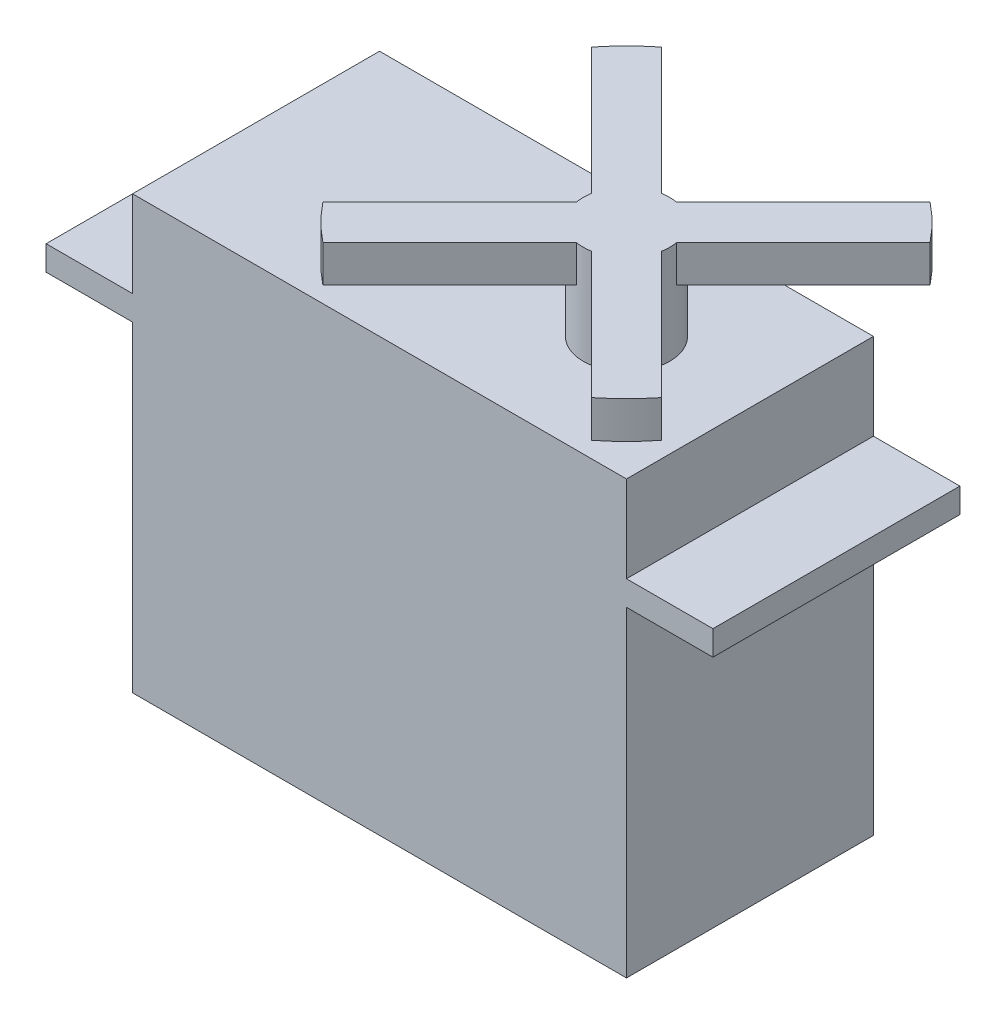
ISO-10303-21;
HEADER;
FILE_DESCRIPTION(('STEP AP214'),'2;1');
FILE_NAME('part.step','',(''),(''),'','','');
FILE_SCHEMA(('AUTOMOTIVE_DESIGN { 1 0 10303 214 1 1 1 1 }'));
ENDSEC;
DATA;
#1=APPLICATION_CONTEXT('core data for automotive mechanical design processes');
#2=APPLICATION_PROTOCOL_DEFINITION('international standard','automotive_design',2000,#1);
#3=PRODUCT_CONTEXT('',#1,'mechanical');
#4=PRODUCT('Part','Part','',(#3));
#5=PRODUCT_RELATED_PRODUCT_CATEGORY('part','',(#4));
#6=PRODUCT_DEFINITION_FORMATION('','',#4);
#7=PRODUCT_DEFINITION_CONTEXT('part definition',#1,'design');
#8=PRODUCT_DEFINITION('design','',#6,#7);
#9=PRODUCT_DEFINITION_SHAPE('','',#8);
#10=(LENGTH_UNIT() NAMED_UNIT(*) SI_UNIT(.MILLI.,.METRE.));
#11=(NAMED_UNIT(*) PLANE_ANGLE_UNIT() SI_UNIT($,.RADIAN.));
#12=(NAMED_UNIT(*) SI_UNIT($,.STERADIAN.) SOLID_ANGLE_UNIT());
#13=UNCERTAINTY_MEASURE_WITH_UNIT(LENGTH_MEASURE(1.E-05),#10,'distance_accuracy_value','');
#14=(GEOMETRIC_REPRESENTATION_CONTEXT(3) GLOBAL_UNCERTAINTY_ASSIGNED_CONTEXT((#13)) GLOBAL_UNIT_ASSIGNED_CONTEXT((#10,
#11,#12)) REPRESENTATION_CONTEXT('',''));
#15=CARTESIAN_POINT('',(0.,0.,0.));
#16=DIRECTION('',(0.,0.,1.));
#17=DIRECTION('',(1.,0.,0.));
#18=AXIS2_PLACEMENT_3D('',#15,#16,#17);
#19=CARTESIAN_POINT('',(-21.8080808080808,23.3564435660373,20.));
#20=DIRECTION('',(0.,-1.,0.));
#21=DIRECTION('',(1.,0.,0.));
#22=AXIS2_PLACEMENT_3D('',#19,#20,#21);
#23=PLANE('',#22);
#24=DIRECTION('',(-1.,0.,0.));
#25=VECTOR('',#24,1.);
#26=CARTESIAN_POINT('',(-21.8080808080808,23.3564435660373,0.));
#27=LINE('',#26,#25);
#28=CARTESIAN_POINT('',(18.1919191919192,23.3564435660373,0.));
#29=VERTEX_POINT('',#28);
#30=CARTESIAN_POINT('',(-21.8080808080808,23.3564435660373,0.));
#31=VERTEX_POINT('',#30);
#32=EDGE_CURVE('E341',#29,#31,#27,.T.);
#33=ORIENTED_EDGE('',*,*,#32,.T.);
#34=DIRECTION('',(0.,0.,-1.));
#35=VECTOR('',#34,1.);
#36=CARTESIAN_POINT('',(-21.8080808080808,23.3564435660373,20.));
#37=LINE('',#36,#35);
#38=CARTESIAN_POINT('',(-21.8080808080808,23.3564435660373,20.));
#39=VERTEX_POINT('',#38);
#40=EDGE_CURVE('E363',#39,#31,#37,.T.);
#41=ORIENTED_EDGE('',*,*,#40,.F.);
#42=DIRECTION('',(-1.,0.,0.));
#43=VECTOR('',#42,1.);
#44=CARTESIAN_POINT('',(-21.8080808080808,23.3564435660373,20.));
#45=LINE('',#44,#43);
#46=CARTESIAN_POINT('',(18.1919191919192,23.3564435660373,20.));
#47=VERTEX_POINT('',#46);
#48=EDGE_CURVE('E361',#47,#39,#45,.T.);
#49=ORIENTED_EDGE('',*,*,#48,.F.);
#50=DIRECTION('',(0.,0.,-1.));
#51=VECTOR('',#50,1.);
#52=CARTESIAN_POINT('',(18.1919191919192,23.3564435660373,20.));
#53=LINE('',#52,#51);
#54=EDGE_CURVE('E390',#47,#29,#53,.T.);
#55=ORIENTED_EDGE('',*,*,#54,.T.);
#56=EDGE_LOOP('',(#33,#41,#49,#55));
#57=FACE_BOUND('',#56,.T.);
#58=CARTESIAN_POINT('',(8.19191919191916,23.3564435660373,10.));
#59=DIRECTION('',(0.,-1.,0.));
#60=DIRECTION('',(1.,0.,0.));
#61=AXIS2_PLACEMENT_3D('',#58,#59,#60);
#62=CIRCLE('',#61,3.5);
#63=CARTESIAN_POINT('',(11.6919191919192,23.3564435660373,10.));
#64=VERTEX_POINT('',#63);
#65=EDGE_CURVE('E422',#64,#64,#62,.F.);
#66=ORIENTED_EDGE('',*,*,#65,.F.);
#67=EDGE_LOOP('',(#66));
#68=FACE_BOUND('',#67,.T.);
#69=ADVANCED_FACE('F31',(#57,#68),#23,.F.);
#70=CARTESIAN_POINT('',(-21.8080808080808,16.3564435660373,20.));
#71=DIRECTION('',(1.,0.,0.));
#72=DIRECTION('',(0.,1.,0.));
#73=AXIS2_PLACEMENT_3D('',#70,#71,#72);
#74=PLANE('',#73);
#75=DIRECTION('',(0.,-1.,0.));
#76=VECTOR('',#75,1.);
#77=CARTESIAN_POINT('',(-21.8080808080808,16.3564435660373,0.));
#78=LINE('',#77,#76);
#79=CARTESIAN_POINT('',(-21.8080808080808,16.3564435660373,0.));
#80=VERTEX_POINT('',#79);
#81=EDGE_CURVE('E364',#31,#80,#78,.T.);
#82=ORIENTED_EDGE('',*,*,#81,.T.);
#83=DIRECTION('',(0.,0.,-1.));
#84=VECTOR('',#83,1.);
#85=CARTESIAN_POINT('',(-21.8080808080808,16.3564435660373,20.));
#86=LINE('',#85,#84);
#87=CARTESIAN_POINT('',(-21.8080808080808,16.3564435660373,20.));
#88=VERTEX_POINT('',#87);
#89=EDGE_CURVE('E420',#88,#80,#86,.T.);
#90=ORIENTED_EDGE('',*,*,#89,.F.);
#91=DIRECTION('',(0.,-1.,0.));
#92=VECTOR('',#91,1.);
#93=CARTESIAN_POINT('',(-21.8080808080808,16.3564435660373,20.));
#94=LINE('',#93,#92);
#95=EDGE_CURVE('E337',#39,#88,#94,.T.);
#96=ORIENTED_EDGE('',*,*,#95,.F.);
#97=ORIENTED_EDGE('',*,*,#40,.T.);
#98=EDGE_LOOP('',(#82,#90,#96,#97));
#99=FACE_BOUND('',#98,.T.);
#100=ADVANCED_FACE('F33',(#99),#74,.F.);
#101=CARTESIAN_POINT('',(-28.8080808080808,16.3564435660373,20.));
#102=DIRECTION('',(0.,-1.,0.));
#103=DIRECTION('',(1.,0.,0.));
#104=AXIS2_PLACEMENT_3D('',#101,#102,#103);
#105=PLANE('',#104);
#106=DIRECTION('',(-1.,0.,0.));
#107=VECTOR('',#106,1.);
#108=CARTESIAN_POINT('',(-28.8080808080808,16.3564435660373,0.));
#109=LINE('',#108,#107);
#110=CARTESIAN_POINT('',(-28.8080808080808,16.3564435660373,0.));
#111=VERTEX_POINT('',#110);
#112=EDGE_CURVE('E367',#80,#111,#109,.T.);
#113=ORIENTED_EDGE('',*,*,#112,.T.);
#114=DIRECTION('',(0.,0.,-1.));
#115=VECTOR('',#114,1.);
#116=CARTESIAN_POINT('',(-28.8080808080808,16.3564435660373,20.));
#117=LINE('',#116,#115);
#118=CARTESIAN_POINT('',(-28.8080808080808,16.3564435660373,20.));
#119=VERTEX_POINT('',#118);
#120=EDGE_CURVE('E417',#119,#111,#117,.T.);
#121=ORIENTED_EDGE('',*,*,#120,.F.);
#122=DIRECTION('',(-1.,0.,0.));
#123=VECTOR('',#122,1.);
#124=CARTESIAN_POINT('',(-28.8080808080808,16.3564435660373,20.));
#125=LINE('',#124,#123);
#126=EDGE_CURVE('E340',#88,#119,#125,.T.);
#127=ORIENTED_EDGE('',*,*,#126,.F.);
#128=ORIENTED_EDGE('',*,*,#89,.T.);
#129=EDGE_LOOP('',(#113,#121,#127,#128));
#130=FACE_BOUND('',#129,.T.);
#131=ADVANCED_FACE('F471',(#130),#105,.F.);
#132=CARTESIAN_POINT('',(-28.8080808080808,14.3564435660373,20.));
#133=DIRECTION('',(1.,0.,0.));
#134=DIRECTION('',(0.,0.,-1.));
#135=AXIS2_PLACEMENT_3D('',#132,#133,#134);
#136=PLANE('',#135);
#137=DIRECTION('',(0.,-1.,0.));
#138=VECTOR('',#137,1.);
#139=CARTESIAN_POINT('',(-28.8080808080808,14.3564435660373,0.));
#140=LINE('',#139,#138);
#141=CARTESIAN_POINT('',(-28.8080808080808,14.3564435660373,0.));
#142=VERTEX_POINT('',#141);
#143=EDGE_CURVE('E369',#111,#142,#140,.T.);
#144=ORIENTED_EDGE('',*,*,#143,.T.);
#145=DIRECTION('',(0.,0.,-1.));
#146=VECTOR('',#145,1.);
#147=CARTESIAN_POINT('',(-28.8080808080808,14.3564435660373,20.));
#148=LINE('',#147,#146);
#149=CARTESIAN_POINT('',(-28.8080808080808,14.3564435660373,20.));
#150=VERTEX_POINT('',#149);
#151=EDGE_CURVE('E414',#150,#142,#148,.T.);
#152=ORIENTED_EDGE('',*,*,#151,.F.);
#153=DIRECTION('',(0.,-1.,0.));
#154=VECTOR('',#153,1.);
#155=CARTESIAN_POINT('',(-28.8080808080808,14.3564435660373,20.));
#156=LINE('',#155,#154);
#157=EDGE_CURVE('E343',#119,#150,#156,.T.);
#158=ORIENTED_EDGE('',*,*,#157,.F.);
#159=ORIENTED_EDGE('',*,*,#120,.T.);
#160=EDGE_LOOP('',(#144,#152,#158,#159));
#161=FACE_BOUND('',#160,.T.);
#162=ADVANCED_FACE('F510',(#161),#136,.F.);
#163=CARTESIAN_POINT('',(-21.8080808080808,14.3564435660373,20.));
#164=DIRECTION('',(0.,1.,0.));
#165=DIRECTION('',(0.,0.,1.));
#166=AXIS2_PLACEMENT_3D('',#163,#164,#165);
#167=PLANE('',#166);
#168=DIRECTION('',(1.,0.,0.));
#169=VECTOR('',#168,1.);
#170=CARTESIAN_POINT('',(-21.8080808080808,14.3564435660373,0.));
#171=LINE('',#170,#169);
#172=CARTESIAN_POINT('',(-21.8080808080808,14.3564435660373,0.));
#173=VERTEX_POINT('',#172);
#174=EDGE_CURVE('E371',#142,#173,#171,.T.);
#175=ORIENTED_EDGE('',*,*,#174,.T.);
#176=DIRECTION('',(0.,0.,-1.));
#177=VECTOR('',#176,1.);
#178=CARTESIAN_POINT('',(-21.8080808080808,14.3564435660373,20.));
#179=LINE('',#178,#177);
#180=CARTESIAN_POINT('',(-21.8080808080808,14.3564435660373,20.));
#181=VERTEX_POINT('',#180);
#182=EDGE_CURVE('E411',#181,#173,#179,.T.);
#183=ORIENTED_EDGE('',*,*,#182,.F.);
#184=DIRECTION('',(1.,0.,0.));
#185=VECTOR('',#184,1.);
#186=CARTESIAN_POINT('',(-21.8080808080808,14.3564435660373,20.));
#187=LINE('',#186,#185);
#188=EDGE_CURVE('E345',#150,#181,#187,.T.);
#189=ORIENTED_EDGE('',*,*,#188,.F.);
#190=ORIENTED_EDGE('',*,*,#151,.T.);
#191=EDGE_LOOP('',(#175,#183,#189,#190));
#192=FACE_BOUND('',#191,.T.);
#193=ADVANCED_FACE('F506',(#192),#167,.F.);
#194=CARTESIAN_POINT('',(-21.8080808080808,-11.6435564339627,20.));
#195=DIRECTION('',(1.,0.,0.));
#196=DIRECTION('',(0.,1.,0.));
#197=AXIS2_PLACEMENT_3D('',#194,#195,#196);
#198=PLANE('',#197);
#199=DIRECTION('',(0.,-1.,0.));
#200=VECTOR('',#199,1.);
#201=CARTESIAN_POINT('',(-21.8080808080808,-11.6435564339627,0.));
#202=LINE('',#201,#200);
#203=CARTESIAN_POINT('',(-21.8080808080808,-11.6435564339627,0.));
#204=VERTEX_POINT('',#203);
#205=EDGE_CURVE('E373',#173,#204,#202,.T.);
#206=ORIENTED_EDGE('',*,*,#205,.T.);
#207=DIRECTION('',(0.,0.,-1.));
#208=VECTOR('',#207,1.);
#209=CARTESIAN_POINT('',(-21.8080808080808,-11.6435564339627,20.));
#210=LINE('',#209,#208);
#211=CARTESIAN_POINT('',(-21.8080808080808,-11.6435564339627,20.));
#212=VERTEX_POINT('',#211);
#213=EDGE_CURVE('E408',#212,#204,#210,.T.);
#214=ORIENTED_EDGE('',*,*,#213,.F.);
#215=DIRECTION('',(0.,-1.,0.));
#216=VECTOR('',#215,1.);
#217=CARTESIAN_POINT('',(-21.8080808080808,-11.6435564339627,20.));
#218=LINE('',#217,#216);
#219=EDGE_CURVE('E347',#181,#212,#218,.T.);
#220=ORIENTED_EDGE('',*,*,#219,.F.);
#221=ORIENTED_EDGE('',*,*,#182,.T.);
#222=EDGE_LOOP('',(#206,#214,#220,#221));
#223=FACE_BOUND('',#222,.T.);
#224=ADVANCED_FACE('F502',(#223),#198,.F.);
#225=CARTESIAN_POINT('',(-21.8080808080808,-11.6435564339627,20.));
#226=DIRECTION('',(0.,1.,0.));
#227=DIRECTION('',(0.,0.,1.));
#228=AXIS2_PLACEMENT_3D('',#225,#226,#227);
#229=PLANE('',#228);
#230=DIRECTION('',(1.,0.,0.));
#231=VECTOR('',#230,1.);
#232=CARTESIAN_POINT('',(-21.8080808080808,-11.6435564339627,0.));
#233=LINE('',#232,#231);
#234=CARTESIAN_POINT('',(18.1919191919192,-11.6435564339627,0.));
#235=VERTEX_POINT('',#234);
#236=EDGE_CURVE('E375',#204,#235,#233,.T.);
#237=ORIENTED_EDGE('',*,*,#236,.T.);
#238=DIRECTION('',(0.,0.,-1.));
#239=VECTOR('',#238,1.);
#240=CARTESIAN_POINT('',(18.1919191919192,-11.6435564339627,20.));
#241=LINE('',#240,#239);
#242=CARTESIAN_POINT('',(18.1919191919192,-11.6435564339627,20.));
#243=VERTEX_POINT('',#242);
#244=EDGE_CURVE('E405',#243,#235,#241,.T.);
#245=ORIENTED_EDGE('',*,*,#244,.F.);
#246=DIRECTION('',(1.,0.,0.));
#247=VECTOR('',#246,1.);
#248=CARTESIAN_POINT('',(-21.8080808080808,-11.6435564339627,20.));
#249=LINE('',#248,#247);
#250=EDGE_CURVE('E349',#212,#243,#249,.T.);
#251=ORIENTED_EDGE('',*,*,#250,.F.);
#252=ORIENTED_EDGE('',*,*,#213,.T.);
#253=EDGE_LOOP('',(#237,#245,#251,#252));
#254=FACE_BOUND('',#253,.T.);
#255=ADVANCED_FACE('F498',(#254),#229,.F.);
#256=CARTESIAN_POINT('',(18.1919191919192,14.3564435660373,20.));
#257=DIRECTION('',(-1.,0.,0.));
#258=DIRECTION('',(0.,-1.,0.));
#259=AXIS2_PLACEMENT_3D('',#256,#257,#258);
#260=PLANE('',#259);
#261=DIRECTION('',(0.,1.,0.));
#262=VECTOR('',#261,1.);
#263=CARTESIAN_POINT('',(18.1919191919192,14.3564435660373,0.));
#264=LINE('',#263,#262);
#265=CARTESIAN_POINT('',(18.1919191919192,14.3564435660373,0.));
#266=VERTEX_POINT('',#265);
#267=EDGE_CURVE('E377',#235,#266,#264,.T.);
#268=ORIENTED_EDGE('',*,*,#267,.T.);
#269=DIRECTION('',(0.,0.,-1.));
#270=VECTOR('',#269,1.);
#271=CARTESIAN_POINT('',(18.1919191919192,14.3564435660373,20.));
#272=LINE('',#271,#270);
#273=CARTESIAN_POINT('',(18.1919191919192,14.3564435660373,20.));
#274=VERTEX_POINT('',#273);
#275=EDGE_CURVE('E402',#274,#266,#272,.T.);
#276=ORIENTED_EDGE('',*,*,#275,.F.);
#277=DIRECTION('',(0.,1.,0.));
#278=VECTOR('',#277,1.);
#279=CARTESIAN_POINT('',(18.1919191919192,14.3564435660373,20.));
#280=LINE('',#279,#278);
#281=EDGE_CURVE('E351',#243,#274,#280,.T.);
#282=ORIENTED_EDGE('',*,*,#281,.F.);
#283=ORIENTED_EDGE('',*,*,#244,.T.);
#284=EDGE_LOOP('',(#268,#276,#282,#283));
#285=FACE_BOUND('',#284,.T.);
#286=ADVANCED_FACE('F494',(#285),#260,.F.);
#287=CARTESIAN_POINT('',(25.1919191919192,14.3564435660373,20.));
#288=DIRECTION('',(0.,1.,0.));
#289=DIRECTION('',(0.,0.,1.));
#290=AXIS2_PLACEMENT_3D('',#287,#288,#289);
#291=PLANE('',#290);
#292=DIRECTION('',(1.,0.,0.));
#293=VECTOR('',#292,1.);
#294=CARTESIAN_POINT('',(25.1919191919192,14.3564435660373,0.));
#295=LINE('',#294,#293);
#296=CARTESIAN_POINT('',(25.1919191919192,14.3564435660373,0.));
#297=VERTEX_POINT('',#296);
#298=EDGE_CURVE('E379',#266,#297,#295,.T.);
#299=ORIENTED_EDGE('',*,*,#298,.T.);
#300=DIRECTION('',(0.,0.,-1.));
#301=VECTOR('',#300,1.);
#302=CARTESIAN_POINT('',(25.1919191919192,14.3564435660373,20.));
#303=LINE('',#302,#301);
#304=CARTESIAN_POINT('',(25.1919191919192,14.3564435660373,20.));
#305=VERTEX_POINT('',#304);
#306=EDGE_CURVE('E399',#305,#297,#303,.T.);
#307=ORIENTED_EDGE('',*,*,#306,.F.);
#308=DIRECTION('',(1.,0.,0.));
#309=VECTOR('',#308,1.);
#310=CARTESIAN_POINT('',(25.1919191919192,14.3564435660373,20.));
#311=LINE('',#310,#309);
#312=EDGE_CURVE('E353',#274,#305,#311,.T.);
#313=ORIENTED_EDGE('',*,*,#312,.F.);
#314=ORIENTED_EDGE('',*,*,#275,.T.);
#315=EDGE_LOOP('',(#299,#307,#313,#314));
#316=FACE_BOUND('',#315,.T.);
#317=ADVANCED_FACE('F490',(#316),#291,.F.);
#318=CARTESIAN_POINT('',(25.1919191919192,16.3564435660373,20.));
#319=DIRECTION('',(-1.,0.,0.));
#320=DIRECTION('',(0.,0.,1.));
#321=AXIS2_PLACEMENT_3D('',#318,#319,#320);
#322=PLANE('',#321);
#323=DIRECTION('',(0.,1.,0.));
#324=VECTOR('',#323,1.);
#325=CARTESIAN_POINT('',(25.1919191919192,16.3564435660373,0.));
#326=LINE('',#325,#324);
#327=CARTESIAN_POINT('',(25.1919191919192,16.3564435660373,0.));
#328=VERTEX_POINT('',#327);
#329=EDGE_CURVE('E381',#297,#328,#326,.T.);
#330=ORIENTED_EDGE('',*,*,#329,.T.);
#331=DIRECTION('',(0.,0.,-1.));
#332=VECTOR('',#331,1.);
#333=CARTESIAN_POINT('',(25.1919191919192,16.3564435660373,20.));
#334=LINE('',#333,#332);
#335=CARTESIAN_POINT('',(25.1919191919192,16.3564435660373,20.));
#336=VERTEX_POINT('',#335);
#337=EDGE_CURVE('E396',#336,#328,#334,.T.);
#338=ORIENTED_EDGE('',*,*,#337,.F.);
#339=DIRECTION('',(0.,1.,0.));
#340=VECTOR('',#339,1.);
#341=CARTESIAN_POINT('',(25.1919191919192,16.3564435660373,20.));
#342=LINE('',#341,#340);
#343=EDGE_CURVE('E355',#305,#336,#342,.T.);
#344=ORIENTED_EDGE('',*,*,#343,.F.);
#345=ORIENTED_EDGE('',*,*,#306,.T.);
#346=EDGE_LOOP('',(#330,#338,#344,#345));
#347=FACE_BOUND('',#346,.T.);
#348=ADVANCED_FACE('F486',(#347),#322,.F.);
#349=CARTESIAN_POINT('',(18.1919191919192,16.3564435660373,20.));
#350=DIRECTION('',(0.,-1.,0.));
#351=DIRECTION('',(1.,0.,0.));
#352=AXIS2_PLACEMENT_3D('',#349,#350,#351);
#353=PLANE('',#352);
#354=DIRECTION('',(-1.,0.,0.));
#355=VECTOR('',#354,1.);
#356=CARTESIAN_POINT('',(18.1919191919192,16.3564435660373,0.));
#357=LINE('',#356,#355);
#358=CARTESIAN_POINT('',(18.1919191919192,16.3564435660373,0.));
#359=VERTEX_POINT('',#358);
#360=EDGE_CURVE('E383',#328,#359,#357,.T.);
#361=ORIENTED_EDGE('',*,*,#360,.T.);
#362=DIRECTION('',(0.,0.,-1.));
#363=VECTOR('',#362,1.);
#364=CARTESIAN_POINT('',(18.1919191919192,16.3564435660373,20.));
#365=LINE('',#364,#363);
#366=CARTESIAN_POINT('',(18.1919191919192,16.3564435660373,20.));
#367=VERTEX_POINT('',#366);
#368=EDGE_CURVE('E393',#367,#359,#365,.T.);
#369=ORIENTED_EDGE('',*,*,#368,.F.);
#370=DIRECTION('',(-1.,0.,0.));
#371=VECTOR('',#370,1.);
#372=CARTESIAN_POINT('',(18.1919191919192,16.3564435660373,20.));
#373=LINE('',#372,#371);
#374=EDGE_CURVE('E357',#336,#367,#373,.T.);
#375=ORIENTED_EDGE('',*,*,#374,.F.);
#376=ORIENTED_EDGE('',*,*,#337,.T.);
#377=EDGE_LOOP('',(#361,#369,#375,#376));
#378=FACE_BOUND('',#377,.T.);
#379=ADVANCED_FACE('F482',(#378),#353,.F.);
#380=CARTESIAN_POINT('',(18.1919191919192,23.3564435660373,20.));
#381=DIRECTION('',(-1.,0.,0.));
#382=DIRECTION('',(0.,-1.,0.));
#383=AXIS2_PLACEMENT_3D('',#380,#381,#382);
#384=PLANE('',#383);
#385=DIRECTION('',(0.,1.,0.));
#386=VECTOR('',#385,1.);
#387=CARTESIAN_POINT('',(18.1919191919192,23.3564435660373,0.));
#388=LINE('',#387,#386);
#389=EDGE_CURVE('E385',#359,#29,#388,.T.);
#390=ORIENTED_EDGE('',*,*,#389,.T.);
#391=ORIENTED_EDGE('',*,*,#54,.F.);
#392=DIRECTION('',(0.,1.,0.));
#393=VECTOR('',#392,1.);
#394=CARTESIAN_POINT('',(18.1919191919192,23.3564435660373,20.));
#395=LINE('',#394,#393);
#396=EDGE_CURVE('E359',#367,#47,#395,.T.);
#397=ORIENTED_EDGE('',*,*,#396,.F.);
#398=ORIENTED_EDGE('',*,*,#368,.T.);
#399=EDGE_LOOP('',(#390,#391,#397,#398));
#400=FACE_BOUND('',#399,.T.);
#401=ADVANCED_FACE('F478',(#400),#384,.F.);
#402=CARTESIAN_POINT('',(-21.8080808080808,23.3564435660373,20.));
#403=DIRECTION('',(0.,0.,-1.));
#404=DIRECTION('',(-1.,0.,0.));
#405=AXIS2_PLACEMENT_3D('',#402,#403,#404);
#406=PLANE('',#405);
#407=ORIENTED_EDGE('',*,*,#95,.T.);
#408=ORIENTED_EDGE('',*,*,#126,.T.);
#409=ORIENTED_EDGE('',*,*,#157,.T.);
#410=ORIENTED_EDGE('',*,*,#188,.T.);
#411=ORIENTED_EDGE('',*,*,#219,.T.);
#412=ORIENTED_EDGE('',*,*,#250,.T.);
#413=ORIENTED_EDGE('',*,*,#281,.T.);
#414=ORIENTED_EDGE('',*,*,#312,.T.);
#415=ORIENTED_EDGE('',*,*,#343,.T.);
#416=ORIENTED_EDGE('',*,*,#374,.T.);
#417=ORIENTED_EDGE('',*,*,#396,.T.);
#418=ORIENTED_EDGE('',*,*,#48,.T.);
#419=EDGE_LOOP('',(#407,#408,#409,#410,#411,#412,#413,#414,#415,#416,#417,#418));
#420=FACE_BOUND('',#419,.T.);
#421=ADVANCED_FACE('F481',(#420),#406,.F.);
#422=CARTESIAN_POINT('',(-21.8080808080808,23.3564435660373,0.));
#423=DIRECTION('',(0.,0.,-1.));
#424=DIRECTION('',(-1.,0.,0.));
#425=AXIS2_PLACEMENT_3D('',#422,#423,#424);
#426=PLANE('',#425);
#427=ORIENTED_EDGE('',*,*,#81,.F.);
#428=ORIENTED_EDGE('',*,*,#32,.F.);
#429=ORIENTED_EDGE('',*,*,#389,.F.);
#430=ORIENTED_EDGE('',*,*,#360,.F.);
#431=ORIENTED_EDGE('',*,*,#329,.F.);
#432=ORIENTED_EDGE('',*,*,#298,.F.);
#433=ORIENTED_EDGE('',*,*,#267,.F.);
#434=ORIENTED_EDGE('',*,*,#236,.F.);
#435=ORIENTED_EDGE('',*,*,#205,.F.);
#436=ORIENTED_EDGE('',*,*,#174,.F.);
#437=ORIENTED_EDGE('',*,*,#143,.F.);
#438=ORIENTED_EDGE('',*,*,#112,.F.);
#439=EDGE_LOOP('',(#427,#428,#429,#430,#431,#432,#433,#434,#435,#436,#437,#438));
#440=FACE_BOUND('',#439,.T.);
#441=ADVANCED_FACE('F476',(#440),#426,.T.);
#442=CARTESIAN_POINT('',(8.19191919191916,31.3564435660373,10.));
#443=DIRECTION('',(0.,-1.,0.));
#444=DIRECTION('',(1.,0.,0.));
#445=AXIS2_PLACEMENT_3D('',#442,#443,#444);
#446=CYLINDRICAL_SURFACE('',#445,3.5);
#447=CARTESIAN_POINT('',(8.19191919191916,28.3564435660373,10.));
#448=DIRECTION('',(0.,-1.,0.));
#449=DIRECTION('',(1.,0.,0.));
#450=AXIS2_PLACEMENT_3D('',#447,#448,#449);
#451=CIRCLE('',#450,3.5);
#452=CARTESIAN_POINT('',(8.80871523070504,28.3564435660373,6.55477683646793));
#453=VERTEX_POINT('',#452);
#454=CARTESIAN_POINT('',(11.6371423554512,28.3564435660373,9.38320396121409));
#455=VERTEX_POINT('',#454);
#456=EDGE_CURVE('E40',#453,#455,#451,.T.);
#457=ORIENTED_EDGE('',*,*,#456,.T.);
#458=DIRECTION('',(0.,1.,0.));
#459=VECTOR('',#458,1.);
#460=CARTESIAN_POINT('',(11.6371423554512,28.3564435660373,9.38320396121409));
#461=LINE('',#460,#459);
#462=CARTESIAN_POINT('',(11.6371423554512,31.3564435660373,9.38320396121409));
#463=VERTEX_POINT('',#462);
#464=EDGE_CURVE('E310',#455,#463,#461,.T.);
#465=ORIENTED_EDGE('',*,*,#464,.T.);
#466=CARTESIAN_POINT('',(8.19191919191916,31.3564435660373,10.));
#467=DIRECTION('',(0.,1.,0.));
#468=DIRECTION('',(-1.,0.,0.));
#469=AXIS2_PLACEMENT_3D('',#466,#467,#468);
#470=CIRCLE('',#469,3.5);
#471=CARTESIAN_POINT('',(11.6371423554513,31.3564435660373,10.6167960387859));
#472=VERTEX_POINT('',#471);
#473=EDGE_CURVE('E449',#472,#463,#470,.T.);
#474=ORIENTED_EDGE('',*,*,#473,.F.);
#475=DIRECTION('',(0.,1.,0.));
#476=VECTOR('',#475,1.);
#477=CARTESIAN_POINT('',(11.6371423554513,28.3564435660373,10.6167960387859));
#478=LINE('',#477,#476);
#479=CARTESIAN_POINT('',(11.6371423554513,28.3564435660373,10.6167960387859));
#480=VERTEX_POINT('',#479);
#481=EDGE_CURVE('E313',#480,#472,#478,.T.);
#482=ORIENTED_EDGE('',*,*,#481,.F.);
#483=CARTESIAN_POINT('',(8.80871523070496,28.3564435660373,13.4452231635321));
#484=VERTEX_POINT('',#483);
#485=EDGE_CURVE('E11',#480,#484,#451,.T.);
#486=ORIENTED_EDGE('',*,*,#485,.T.);
#487=DIRECTION('',(0.,1.,0.));
#488=VECTOR('',#487,1.);
#489=CARTESIAN_POINT('',(8.80871523070496,28.3564435660373,13.4452231635321));
#490=LINE('',#489,#488);
#491=CARTESIAN_POINT('',(8.80871523070496,31.3564435660373,13.4452231635321));
#492=VERTEX_POINT('',#491);
#493=EDGE_CURVE('E320',#484,#492,#490,.T.);
#494=ORIENTED_EDGE('',*,*,#493,.T.);
#495=CARTESIAN_POINT('',(7.5751231531333,31.3564435660373,13.4452231635321));
#496=VERTEX_POINT('',#495);
#497=EDGE_CURVE('E336',#496,#492,#470,.T.);
#498=ORIENTED_EDGE('',*,*,#497,.F.);
#499=DIRECTION('',(0.,1.,0.));
#500=VECTOR('',#499,1.);
#501=CARTESIAN_POINT('',(7.5751231531333,28.3564435660373,13.4452231635321));
#502=LINE('',#501,#500);
#503=CARTESIAN_POINT('',(7.5751231531333,28.3564435660373,13.4452231635321));
#504=VERTEX_POINT('',#503);
#505=EDGE_CURVE('E323',#504,#496,#502,.T.);
#506=ORIENTED_EDGE('',*,*,#505,.F.);
#507=CARTESIAN_POINT('',(4.74669602838708,28.3564435660373,10.6167960387859));
#508=VERTEX_POINT('',#507);
#509=EDGE_CURVE('E39',#504,#508,#451,.T.);
#510=ORIENTED_EDGE('',*,*,#509,.T.);
#511=DIRECTION('',(0.,1.,0.));
#512=VECTOR('',#511,1.);
#513=CARTESIAN_POINT('',(4.74669602838708,28.3564435660373,10.6167960387859));
#514=LINE('',#513,#512);
#515=CARTESIAN_POINT('',(4.74669602838708,31.3564435660373,10.6167960387859));
#516=VERTEX_POINT('',#515);
#517=EDGE_CURVE('E330',#508,#516,#514,.T.);
#518=ORIENTED_EDGE('',*,*,#517,.T.);
#519=CARTESIAN_POINT('',(4.74669602838707,31.3564435660373,9.38320396121413));
#520=VERTEX_POINT('',#519);
#521=EDGE_CURVE('E300',#520,#516,#470,.T.);
#522=ORIENTED_EDGE('',*,*,#521,.F.);
#523=DIRECTION('',(0.,1.,0.));
#524=VECTOR('',#523,1.);
#525=CARTESIAN_POINT('',(4.74669602838708,28.3564435660373,9.38320396121415));
#526=LINE('',#525,#524);
#527=CARTESIAN_POINT('',(4.74669602838708,28.3564435660373,9.38320396121415));
#528=VERTEX_POINT('',#527);
#529=EDGE_CURVE('E227',#528,#520,#526,.T.);
#530=ORIENTED_EDGE('',*,*,#529,.F.);
#531=CARTESIAN_POINT('',(7.57512315313327,28.3564435660373,6.55477683646795));
#532=VERTEX_POINT('',#531);
#533=EDGE_CURVE('E237',#528,#532,#451,.T.);
#534=ORIENTED_EDGE('',*,*,#533,.T.);
#535=DIRECTION('',(0.,1.,0.));
#536=VECTOR('',#535,1.);
#537=CARTESIAN_POINT('',(7.57512315313327,28.3564435660373,6.55477683646795));
#538=LINE('',#537,#536);
#539=CARTESIAN_POINT('',(7.57512315313327,31.3564435660373,6.55477683646795));
#540=VERTEX_POINT('',#539);
#541=EDGE_CURVE('E301',#532,#540,#538,.T.);
#542=ORIENTED_EDGE('',*,*,#541,.T.);
#543=CARTESIAN_POINT('',(8.80871523070504,31.3564435660373,6.55477683646791));
#544=VERTEX_POINT('',#543);
#545=EDGE_CURVE('E335',#544,#540,#470,.T.);
#546=ORIENTED_EDGE('',*,*,#545,.F.);
#547=DIRECTION('',(0.,1.,0.));
#548=VECTOR('',#547,1.);
#549=CARTESIAN_POINT('',(8.80871523070504,28.3564435660373,6.55477683646793));
#550=LINE('',#549,#548);
#551=EDGE_CURVE('E304',#453,#544,#550,.T.);
#552=ORIENTED_EDGE('',*,*,#551,.F.);
#553=EDGE_LOOP('',(#457,#465,#474,#482,#486,#494,#498,#506,#510,#518,#522,#530,#534,#542,#546,#552));
#554=FACE_BOUND('',#553,.T.);
#555=ORIENTED_EDGE('',*,*,#65,.T.);
#556=EDGE_LOOP('',(#555));
#557=FACE_BOUND('',#556,.T.);
#558=ADVANCED_FACE('F431',(#554,#557),#446,.T.);
#559=CARTESIAN_POINT('',(8.19191919191916,31.3564435660373,10.));
#560=DIRECTION('',(0.,1.,0.));
#561=DIRECTION('',(-1.,0.,0.));
#562=AXIS2_PLACEMENT_3D('',#559,#560,#561);
#563=PLANE('',#562);
#564=ORIENTED_EDGE('',*,*,#521,.T.);
#565=DIRECTION('',(-0.707106781186543,0.,0.707106781186552));
#566=VECTOR('',#565,1.);
#567=CARTESIAN_POINT('',(4.74669602838708,31.3564435660373,10.6167960387859));
#568=LINE('',#567,#566);
#569=CARTESIAN_POINT('',(-5.51558522359812,31.3564435660373,20.8790772907712));
#570=VERTEX_POINT('',#569);
#571=EDGE_CURVE('E277',#516,#570,#568,.T.);
#572=ORIENTED_EDGE('',*,*,#571,.T.);
#573=CARTESIAN_POINT('',(8.19191919191917,31.3564435660373,10.));
#574=DIRECTION('',(0.,1.,0.));
#575=DIRECTION('',(1.,0.,0.));
#576=AXIS2_PLACEMENT_3D('',#573,#574,#575);
#577=CIRCLE('',#576,17.5);
#578=CARTESIAN_POINT('',(-2.68715809885191,31.3564435660373,23.7075044155174));
#579=VERTEX_POINT('',#578);
#580=EDGE_CURVE('E280',#570,#579,#577,.T.);
#581=ORIENTED_EDGE('',*,*,#580,.T.);
#582=DIRECTION('',(0.707106781186544,0.,-0.707106781186551));
#583=VECTOR('',#582,1.);
#584=CARTESIAN_POINT('',(-2.68715809885191,31.3564435660373,23.7075044155174));
#585=LINE('',#584,#583);
#586=EDGE_CURVE('E283',#579,#496,#585,.T.);
#587=ORIENTED_EDGE('',*,*,#586,.T.);
#588=ORIENTED_EDGE('',*,*,#497,.T.);
#589=DIRECTION('',(0.707106781186552,0.,0.707106781186543));
#590=VECTOR('',#589,1.);
#591=CARTESIAN_POINT('',(8.80871523070496,31.3564435660373,13.4452231635321));
#592=LINE('',#591,#590);
#593=CARTESIAN_POINT('',(19.0709964826903,31.3564435660373,23.7075044155173));
#594=VERTEX_POINT('',#593);
#595=EDGE_CURVE('E285',#492,#594,#592,.T.);
#596=ORIENTED_EDGE('',*,*,#595,.T.);
#597=CARTESIAN_POINT('',(8.19191919191917,31.3564435660373,10.));
#598=DIRECTION('',(0.,1.,0.));
#599=DIRECTION('',(1.,0.,0.));
#600=AXIS2_PLACEMENT_3D('',#597,#598,#599);
#601=CIRCLE('',#600,17.5);
#602=CARTESIAN_POINT('',(21.8994236074366,31.3564435660373,20.8790772907711));
#603=VERTEX_POINT('',#602);
#604=EDGE_CURVE('E288',#594,#603,#601,.T.);
#605=ORIENTED_EDGE('',*,*,#604,.T.);
#606=DIRECTION('',(-0.707106781186552,0.,-0.707106781186543));
#607=VECTOR('',#606,1.);
#608=CARTESIAN_POINT('',(21.8994236074366,31.3564435660373,20.8790772907711));
#609=LINE('',#608,#607);
#610=EDGE_CURVE('E291',#603,#472,#609,.T.);
#611=ORIENTED_EDGE('',*,*,#610,.T.);
#612=ORIENTED_EDGE('',*,*,#473,.T.);
#613=DIRECTION('',(0.707106781186544,0.,-0.707106781186552));
#614=VECTOR('',#613,1.);
#615=CARTESIAN_POINT('',(11.6371423554512,31.3564435660373,9.38320396121409));
#616=LINE('',#615,#614);
#617=CARTESIAN_POINT('',(21.8982057492731,31.3564435660373,-0.877859432607852));
#618=VERTEX_POINT('',#617);
#619=EDGE_CURVE('E293',#463,#618,#616,.T.);
#620=ORIENTED_EDGE('',*,*,#619,.T.);
#621=CARTESIAN_POINT('',(8.19191919191917,31.3564435660373,10.));
#622=DIRECTION('',(0.,1.,0.));
#623=DIRECTION('',(1.,0.,0.));
#624=AXIS2_PLACEMENT_3D('',#621,#622,#623);
#625=CIRCLE('',#624,17.4982889742933);
#626=CARTESIAN_POINT('',(19.0697786245269,31.3564435660373,-3.70628655735403));
#627=VERTEX_POINT('',#626);
#628=EDGE_CURVE('E296',#618,#627,#625,.T.);
#629=ORIENTED_EDGE('',*,*,#628,.T.);
#630=DIRECTION('',(-0.707106781186543,0.,0.707106781186552));
#631=VECTOR('',#630,1.);
#632=CARTESIAN_POINT('',(8.80871523070504,31.3564435660373,6.55477683646791));
#633=LINE('',#632,#631);
#634=EDGE_CURVE('E54',#627,#544,#633,.T.);
#635=ORIENTED_EDGE('',*,*,#634,.T.);
#636=ORIENTED_EDGE('',*,*,#545,.T.);
#637=DIRECTION('',(-0.707106781186552,0.,-0.707106781186543));
#638=VECTOR('',#637,1.);
#639=CARTESIAN_POINT('',(7.57512315313327,31.3564435660373,6.55477683646795));
#640=LINE('',#639,#638);
#641=CARTESIAN_POINT('',(-2.68715809885207,31.3564435660373,-3.70750441551728));
#642=VERTEX_POINT('',#641);
#643=EDGE_CURVE('E242',#540,#642,#640,.T.);
#644=ORIENTED_EDGE('',*,*,#643,.T.);
#645=CARTESIAN_POINT('',(8.19191919191917,31.3564435660373,10.));
#646=DIRECTION('',(0.,1.,0.));
#647=DIRECTION('',(1.,0.,0.));
#648=AXIS2_PLACEMENT_3D('',#645,#646,#647);
#649=CIRCLE('',#648,17.5);
#650=CARTESIAN_POINT('',(-5.51558522359824,31.3564435660373,-0.879077290771069));
#651=VERTEX_POINT('',#650);
#652=EDGE_CURVE('E274',#642,#651,#649,.T.);
#653=ORIENTED_EDGE('',*,*,#652,.T.);
#654=DIRECTION('',(0.707106781186552,0.,0.707106781186543));
#655=VECTOR('',#654,1.);
#656=CARTESIAN_POINT('',(4.7466960283871,31.3564435660373,9.38320396121415));
#657=LINE('',#656,#655);
#658=EDGE_CURVE('E47',#651,#520,#657,.T.);
#659=ORIENTED_EDGE('',*,*,#658,.T.);
#660=EDGE_LOOP('',(#564,#572,#581,#587,#588,#596,#605,#611,#612,#620,#629,#635,#636,#644,#653,#659));
#661=FACE_BOUND('',#660,.T.);
#662=ADVANCED_FACE('F447',(#661),#563,.T.);
#663=CARTESIAN_POINT('',(8.19191919191917,28.3564435660373,10.));
#664=DIRECTION('',(0.,1.,0.));
#665=DIRECTION('',(-1.,0.,0.));
#666=AXIS2_PLACEMENT_3D('',#663,#664,#665);
#667=CYLINDRICAL_SURFACE('',#666,17.4982889742933);
#668=ORIENTED_EDGE('',*,*,#628,.F.);
#669=DIRECTION('',(0.,1.,0.));
#670=VECTOR('',#669,1.);
#671=CARTESIAN_POINT('',(21.8982057492731,28.3564435660373,-0.877859432607852));
#672=LINE('',#671,#670);
#673=CARTESIAN_POINT('',(21.8982057492731,28.3564435660373,-0.877859432607852));
#674=VERTEX_POINT('',#673);
#675=EDGE_CURVE('E308',#674,#618,#672,.T.);
#676=ORIENTED_EDGE('',*,*,#675,.F.);
#677=CARTESIAN_POINT('',(8.19191919191917,28.3564435660373,10.));
#678=DIRECTION('',(0.,1.,0.));
#679=DIRECTION('',(1.,0.,0.));
#680=AXIS2_PLACEMENT_3D('',#677,#678,#679);
#681=CIRCLE('',#680,17.4982889742933);
#682=CARTESIAN_POINT('',(19.0697786245269,28.3564435660373,-3.70628655735403));
#683=VERTEX_POINT('',#682);
#684=EDGE_CURVE('E267',#674,#683,#681,.T.);
#685=ORIENTED_EDGE('',*,*,#684,.T.);
#686=DIRECTION('',(0.,1.,0.));
#687=VECTOR('',#686,1.);
#688=CARTESIAN_POINT('',(19.0697786245269,28.3564435660373,-3.70628655735403));
#689=LINE('',#688,#687);
#690=EDGE_CURVE('E306',#683,#627,#689,.T.);
#691=ORIENTED_EDGE('',*,*,#690,.T.);
#692=EDGE_LOOP('',(#668,#676,#685,#691));
#693=FACE_BOUND('',#692,.T.);
#694=ADVANCED_FACE('F563',(#693),#667,.T.);
#695=CARTESIAN_POINT('',(8.19191919191917,28.3564435660373,10.));
#696=DIRECTION('',(0.,-1.,0.));
#697=DIRECTION('',(1.,0.,0.));
#698=AXIS2_PLACEMENT_3D('',#695,#696,#697);
#699=PLANE('',#698);
#700=ORIENTED_EDGE('',*,*,#456,.F.);
#701=DIRECTION('',(-0.707106781186543,0.,0.707106781186552));
#702=VECTOR('',#701,1.);
#703=CARTESIAN_POINT('',(8.80871523070504,28.3564435660373,6.55477683646791));
#704=LINE('',#703,#702);
#705=EDGE_CURVE('E270',#683,#453,#704,.T.);
#706=ORIENTED_EDGE('',*,*,#705,.F.);
#707=ORIENTED_EDGE('',*,*,#684,.F.);
#708=DIRECTION('',(0.707106781186544,0.,-0.707106781186552));
#709=VECTOR('',#708,1.);
#710=CARTESIAN_POINT('',(11.6371423554512,28.3564435660373,9.38320396121409));
#711=LINE('',#710,#709);
#712=EDGE_CURVE('E264',#455,#674,#711,.T.);
#713=ORIENTED_EDGE('',*,*,#712,.F.);
#714=EDGE_LOOP('',(#700,#706,#707,#713));
#715=FACE_BOUND('',#714,.T.);
#716=ADVANCED_FACE('F587',(#715),#699,.T.);
#717=CARTESIAN_POINT('',(11.6371423554512,28.3564435660373,9.38320396121409));
#718=DIRECTION('',(0.707106781186551,0.,0.707106781186544));
#719=DIRECTION('',(0.707106781186544,0.,-0.707106781186551));
#720=AXIS2_PLACEMENT_3D('',#717,#718,#719);
#721=PLANE('',#720);
#722=ORIENTED_EDGE('',*,*,#619,.F.);
#723=ORIENTED_EDGE('',*,*,#464,.F.);
#724=ORIENTED_EDGE('',*,*,#712,.T.);
#725=ORIENTED_EDGE('',*,*,#675,.T.);
#726=EDGE_LOOP('',(#722,#723,#724,#725));
#727=FACE_BOUND('',#726,.T.);
#728=ADVANCED_FACE('F584',(#727),#721,.T.);
#729=CARTESIAN_POINT('',(8.80871523070504,28.3564435660373,6.55477683646791));
#730=DIRECTION('',(-0.707106781186552,0.,-0.707106781186543));
#731=DIRECTION('',(-0.707106781186543,0.,0.707106781186552));
#732=AXIS2_PLACEMENT_3D('',#729,#730,#731);
#733=PLANE('',#732);
#734=ORIENTED_EDGE('',*,*,#634,.F.);
#735=ORIENTED_EDGE('',*,*,#690,.F.);
#736=ORIENTED_EDGE('',*,*,#705,.T.);
#737=ORIENTED_EDGE('',*,*,#551,.T.);
#738=EDGE_LOOP('',(#734,#735,#736,#737));
#739=FACE_BOUND('',#738,.T.);
#740=ADVANCED_FACE('F565',(#739),#733,.T.);
#741=CARTESIAN_POINT('',(8.19191919191917,28.3564435660373,10.));
#742=DIRECTION('',(0.,1.,0.));
#743=DIRECTION('',(-1.,0.,0.));
#744=AXIS2_PLACEMENT_3D('',#741,#742,#743);
#745=CYLINDRICAL_SURFACE('',#744,17.5);
#746=ORIENTED_EDGE('',*,*,#652,.F.);
#747=DIRECTION('',(0.,1.,0.));
#748=VECTOR('',#747,1.);
#749=CARTESIAN_POINT('',(-2.68715809885207,28.3564435660373,-3.70750441551728));
#750=LINE('',#749,#748);
#751=CARTESIAN_POINT('',(-2.68715809885207,28.3564435660373,-3.70750441551728));
#752=VERTEX_POINT('',#751);
#753=EDGE_CURVE('E241',#752,#642,#750,.T.);
#754=ORIENTED_EDGE('',*,*,#753,.F.);
#755=CARTESIAN_POINT('',(8.19191919191917,28.3564435660373,10.));
#756=DIRECTION('',(0.,1.,0.));
#757=DIRECTION('',(1.,0.,0.));
#758=AXIS2_PLACEMENT_3D('',#755,#756,#757);
#759=CIRCLE('',#758,17.5);
#760=CARTESIAN_POINT('',(-5.51558522359824,28.3564435660373,-0.879077290771069));
#761=VERTEX_POINT('',#760);
#762=EDGE_CURVE('E234',#752,#761,#759,.T.);
#763=ORIENTED_EDGE('',*,*,#762,.T.);
#764=DIRECTION('',(0.,1.,0.));
#765=VECTOR('',#764,1.);
#766=CARTESIAN_POINT('',(-5.51558522359824,28.3564435660373,-0.879077290771069));
#767=LINE('',#766,#765);
#768=EDGE_CURVE('E219',#761,#651,#767,.T.);
#769=ORIENTED_EDGE('',*,*,#768,.T.);
#770=EDGE_LOOP('',(#746,#754,#763,#769));
#771=FACE_BOUND('',#770,.T.);
#772=ADVANCED_FACE('F240',(#771),#745,.T.);
#773=ORIENTED_EDGE('',*,*,#533,.F.);
#774=DIRECTION('',(0.707106781186552,0.,0.707106781186543));
#775=VECTOR('',#774,1.);
#776=CARTESIAN_POINT('',(4.7466960283871,28.3564435660373,9.38320396121415));
#777=LINE('',#776,#775);
#778=EDGE_CURVE('E222',#761,#528,#777,.T.);
#779=ORIENTED_EDGE('',*,*,#778,.F.);
#780=ORIENTED_EDGE('',*,*,#762,.F.);
#781=DIRECTION('',(-0.707106781186552,0.,-0.707106781186543));
#782=VECTOR('',#781,1.);
#783=CARTESIAN_POINT('',(7.57512315313327,28.3564435660373,6.55477683646795));
#784=LINE('',#783,#782);
#785=EDGE_CURVE('E228',#532,#752,#784,.T.);
#786=ORIENTED_EDGE('',*,*,#785,.F.);
#787=EDGE_LOOP('',(#773,#779,#780,#786));
#788=FACE_BOUND('',#787,.T.);
#789=ADVANCED_FACE('F232',(#788),#699,.T.);
#790=CARTESIAN_POINT('',(4.7466960283871,28.3564435660373,9.38320396121415));
#791=DIRECTION('',(-0.707106781186543,0.,0.707106781186552));
#792=DIRECTION('',(0.707106781186552,0.,0.707106781186543));
#793=AXIS2_PLACEMENT_3D('',#790,#791,#792);
#794=PLANE('',#793);
#795=ORIENTED_EDGE('',*,*,#658,.F.);
#796=ORIENTED_EDGE('',*,*,#768,.F.);
#797=ORIENTED_EDGE('',*,*,#778,.T.);
#798=ORIENTED_EDGE('',*,*,#529,.T.);
#799=EDGE_LOOP('',(#795,#796,#797,#798));
#800=FACE_BOUND('',#799,.T.);
#801=ADVANCED_FACE('F221',(#800),#794,.T.);
#802=CARTESIAN_POINT('',(7.57512315313327,28.3564435660373,6.55477683646795));
#803=DIRECTION('',(0.707106781186543,0.,-0.707106781186552));
#804=DIRECTION('',(-0.707106781186552,0.,-0.707106781186543));
#805=AXIS2_PLACEMENT_3D('',#802,#803,#804);
#806=PLANE('',#805);
#807=ORIENTED_EDGE('',*,*,#643,.F.);
#808=ORIENTED_EDGE('',*,*,#541,.F.);
#809=ORIENTED_EDGE('',*,*,#785,.T.);
#810=ORIENTED_EDGE('',*,*,#753,.T.);
#811=EDGE_LOOP('',(#807,#808,#809,#810));
#812=FACE_BOUND('',#811,.T.);
#813=ADVANCED_FACE('F454',(#812),#806,.T.);
#814=CARTESIAN_POINT('',(8.19191919191917,28.3564435660373,10.));
#815=DIRECTION('',(0.,1.,0.));
#816=DIRECTION('',(-1.,0.,0.));
#817=AXIS2_PLACEMENT_3D('',#814,#815,#816);
#818=CYLINDRICAL_SURFACE('',#817,17.5);
#819=ORIENTED_EDGE('',*,*,#580,.F.);
#820=DIRECTION('',(0.,1.,0.));
#821=VECTOR('',#820,1.);
#822=CARTESIAN_POINT('',(-5.51558522359812,28.3564435660373,20.8790772907712));
#823=LINE('',#822,#821);
#824=CARTESIAN_POINT('',(-5.51558522359812,28.3564435660373,20.8790772907712));
#825=VERTEX_POINT('',#824);
#826=EDGE_CURVE('E328',#825,#570,#823,.T.);
#827=ORIENTED_EDGE('',*,*,#826,.F.);
#828=CARTESIAN_POINT('',(8.19191919191917,28.3564435660373,10.));
#829=DIRECTION('',(0.,1.,0.));
#830=DIRECTION('',(1.,0.,0.));
#831=AXIS2_PLACEMENT_3D('',#828,#829,#830);
#832=CIRCLE('',#831,17.5);
#833=CARTESIAN_POINT('',(-2.68715809885191,28.3564435660373,23.7075044155174));
#834=VERTEX_POINT('',#833);
#835=EDGE_CURVE('E249',#825,#834,#832,.T.);
#836=ORIENTED_EDGE('',*,*,#835,.T.);
#837=DIRECTION('',(0.,1.,0.));
#838=VECTOR('',#837,1.);
#839=CARTESIAN_POINT('',(-2.68715809885191,28.3564435660373,23.7075044155174));
#840=LINE('',#839,#838);
#841=EDGE_CURVE('E326',#834,#579,#840,.T.);
#842=ORIENTED_EDGE('',*,*,#841,.T.);
#843=EDGE_LOOP('',(#819,#827,#836,#842));
#844=FACE_BOUND('',#843,.T.);
#845=ADVANCED_FACE('F444',(#844),#818,.T.);
#846=ORIENTED_EDGE('',*,*,#509,.F.);
#847=DIRECTION('',(0.707106781186544,0.,-0.707106781186551));
#848=VECTOR('',#847,1.);
#849=CARTESIAN_POINT('',(-2.68715809885191,28.3564435660373,23.7075044155174));
#850=LINE('',#849,#848);
#851=EDGE_CURVE('E252',#834,#504,#850,.T.);
#852=ORIENTED_EDGE('',*,*,#851,.F.);
#853=ORIENTED_EDGE('',*,*,#835,.F.);
#854=DIRECTION('',(-0.707106781186543,0.,0.707106781186552));
#855=VECTOR('',#854,1.);
#856=CARTESIAN_POINT('',(4.74669602838708,28.3564435660373,10.6167960387859));
#857=LINE('',#856,#855);
#858=EDGE_CURVE('E238',#508,#825,#857,.T.);
#859=ORIENTED_EDGE('',*,*,#858,.F.);
#860=EDGE_LOOP('',(#846,#852,#853,#859));
#861=FACE_BOUND('',#860,.T.);
#862=ADVANCED_FACE('F437',(#861),#699,.T.);
#863=CARTESIAN_POINT('',(4.74669602838708,28.3564435660373,10.6167960387859));
#864=DIRECTION('',(-0.707106781186552,0.,-0.707106781186543));
#865=DIRECTION('',(-0.707106781186543,0.,0.707106781186552));
#866=AXIS2_PLACEMENT_3D('',#863,#864,#865);
#867=PLANE('',#866);
#868=ORIENTED_EDGE('',*,*,#571,.F.);
#869=ORIENTED_EDGE('',*,*,#517,.F.);
#870=ORIENTED_EDGE('',*,*,#858,.T.);
#871=ORIENTED_EDGE('',*,*,#826,.T.);
#872=EDGE_LOOP('',(#868,#869,#870,#871));
#873=FACE_BOUND('',#872,.T.);
#874=ADVANCED_FACE('F446',(#873),#867,.T.);
#875=CARTESIAN_POINT('',(-2.68715809885191,28.3564435660373,23.7075044155174));
#876=DIRECTION('',(0.707106781186551,0.,0.707106781186544));
#877=DIRECTION('',(0.707106781186544,0.,-0.707106781186551));
#878=AXIS2_PLACEMENT_3D('',#875,#876,#877);
#879=PLANE('',#878);
#880=ORIENTED_EDGE('',*,*,#586,.F.);
#881=ORIENTED_EDGE('',*,*,#841,.F.);
#882=ORIENTED_EDGE('',*,*,#851,.T.);
#883=ORIENTED_EDGE('',*,*,#505,.T.);
#884=EDGE_LOOP('',(#880,#881,#882,#883));
#885=FACE_BOUND('',#884,.T.);
#886=ADVANCED_FACE('F441',(#885),#879,.T.);
#887=ORIENTED_EDGE('',*,*,#485,.F.);
#888=DIRECTION('',(-0.707106781186552,0.,-0.707106781186543));
#889=VECTOR('',#888,1.);
#890=CARTESIAN_POINT('',(21.8994236074366,28.3564435660373,20.8790772907711));
#891=LINE('',#890,#889);
#892=CARTESIAN_POINT('',(21.8994236074366,28.3564435660373,20.8790772907711));
#893=VERTEX_POINT('',#892);
#894=EDGE_CURVE('E261',#893,#480,#891,.T.);
#895=ORIENTED_EDGE('',*,*,#894,.F.);
#896=CARTESIAN_POINT('',(8.19191919191917,28.3564435660373,10.));
#897=DIRECTION('',(0.,1.,0.));
#898=DIRECTION('',(1.,0.,0.));
#899=AXIS2_PLACEMENT_3D('',#896,#897,#898);
#900=CIRCLE('',#899,17.5);
#901=CARTESIAN_POINT('',(19.0709964826903,28.3564435660373,23.7075044155173));
#902=VERTEX_POINT('',#901);
#903=EDGE_CURVE('E258',#902,#893,#900,.T.);
#904=ORIENTED_EDGE('',*,*,#903,.F.);
#905=DIRECTION('',(0.707106781186552,0.,0.707106781186543));
#906=VECTOR('',#905,1.);
#907=CARTESIAN_POINT('',(8.80871523070496,28.3564435660373,13.4452231635321));
#908=LINE('',#907,#906);
#909=EDGE_CURVE('E255',#484,#902,#908,.T.);
#910=ORIENTED_EDGE('',*,*,#909,.F.);
#911=EDGE_LOOP('',(#887,#895,#904,#910));
#912=FACE_BOUND('',#911,.T.);
#913=ADVANCED_FACE('F571',(#912),#699,.T.);
#914=CARTESIAN_POINT('',(21.8994236074366,28.3564435660373,20.8790772907711));
#915=DIRECTION('',(0.707106781186543,0.,-0.707106781186552));
#916=DIRECTION('',(-0.707106781186552,0.,-0.707106781186543));
#917=AXIS2_PLACEMENT_3D('',#914,#915,#916);
#918=PLANE('',#917);
#919=ORIENTED_EDGE('',*,*,#610,.F.);
#920=DIRECTION('',(0.,1.,0.));
#921=VECTOR('',#920,1.);
#922=CARTESIAN_POINT('',(21.8994236074366,28.3564435660373,20.8790772907711));
#923=LINE('',#922,#921);
#924=EDGE_CURVE('E316',#893,#603,#923,.T.);
#925=ORIENTED_EDGE('',*,*,#924,.F.);
#926=ORIENTED_EDGE('',*,*,#894,.T.);
#927=ORIENTED_EDGE('',*,*,#481,.T.);
#928=EDGE_LOOP('',(#919,#925,#926,#927));
#929=FACE_BOUND('',#928,.T.);
#930=ADVANCED_FACE('F579',(#929),#918,.T.);
#931=CARTESIAN_POINT('',(8.19191919191917,28.3564435660373,10.));
#932=DIRECTION('',(0.,1.,0.));
#933=DIRECTION('',(-1.,0.,0.));
#934=AXIS2_PLACEMENT_3D('',#931,#932,#933);
#935=CYLINDRICAL_SURFACE('',#934,17.5);
#936=ORIENTED_EDGE('',*,*,#604,.F.);
#937=DIRECTION('',(0.,1.,0.));
#938=VECTOR('',#937,1.);
#939=CARTESIAN_POINT('',(19.0709964826903,28.3564435660373,23.7075044155173));
#940=LINE('',#939,#938);
#941=EDGE_CURVE('E318',#902,#594,#940,.T.);
#942=ORIENTED_EDGE('',*,*,#941,.F.);
#943=ORIENTED_EDGE('',*,*,#903,.T.);
#944=ORIENTED_EDGE('',*,*,#924,.T.);
#945=EDGE_LOOP('',(#936,#942,#943,#944));
#946=FACE_BOUND('',#945,.T.);
#947=ADVANCED_FACE('F575',(#946),#935,.T.);
#948=CARTESIAN_POINT('',(8.80871523070496,28.3564435660373,13.4452231635321));
#949=DIRECTION('',(-0.707106781186543,0.,0.707106781186552));
#950=DIRECTION('',(0.707106781186552,0.,0.707106781186543));
#951=AXIS2_PLACEMENT_3D('',#948,#949,#950);
#952=PLANE('',#951);
#953=ORIENTED_EDGE('',*,*,#595,.F.);
#954=ORIENTED_EDGE('',*,*,#493,.F.);
#955=ORIENTED_EDGE('',*,*,#909,.T.);
#956=ORIENTED_EDGE('',*,*,#941,.T.);
#957=EDGE_LOOP('',(#953,#954,#955,#956));
#958=FACE_BOUND('',#957,.T.);
#959=ADVANCED_FACE('F572',(#958),#952,.T.);
#960=CLOSED_SHELL('',(#69,#100,#131,#162,#193,#224,#255,#286,#317,#348,#379,#401,#421,#441,#558,
#662,#694,#716,#728,#740,#772,#789,#801,#813,#845,#862,#874,#886,#913,#930,#947,#959));
#961=MANIFOLD_SOLID_BREP('B2',#960);
#962=ADVANCED_BREP_SHAPE_REPRESENTATION('',(#18,#961),#14);
#963=SHAPE_DEFINITION_REPRESENTATION(#9,#962);
ENDSEC;
END-ISO-10303-21;
